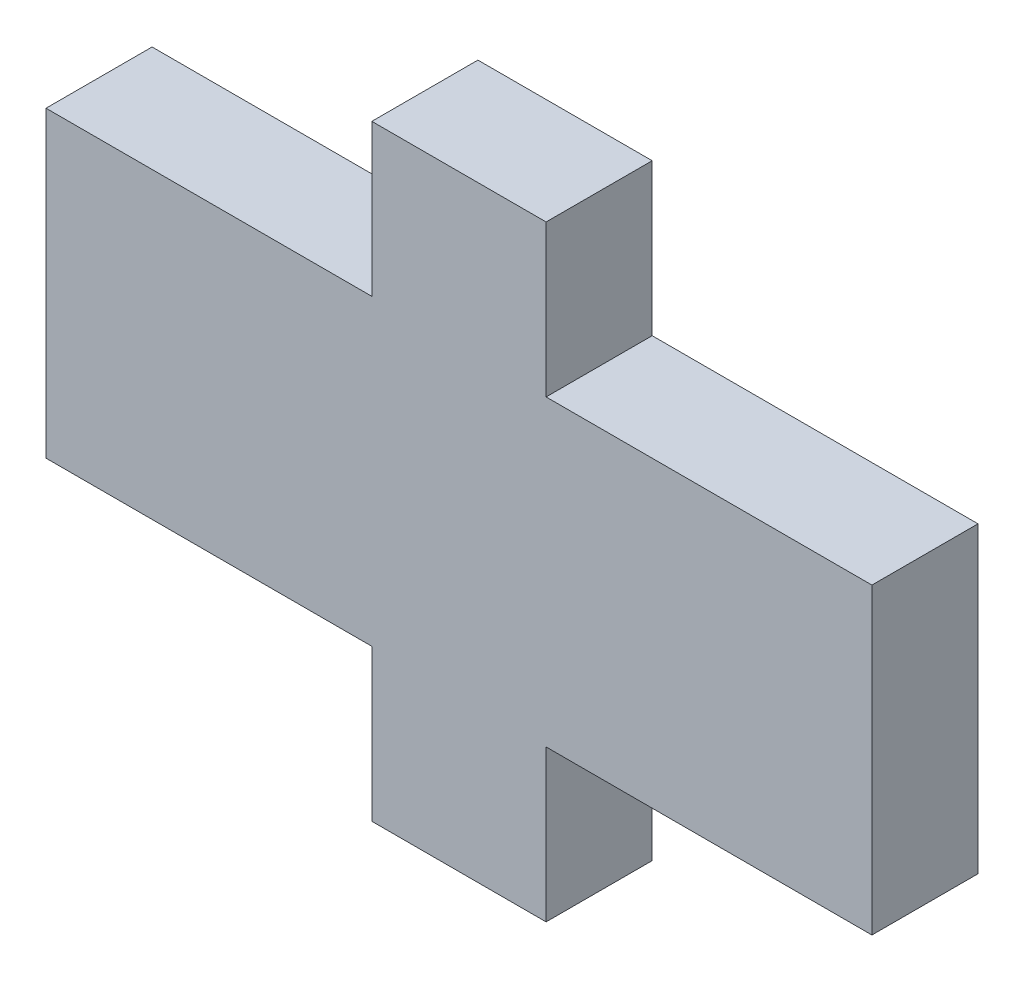
ISO-10303-21;
HEADER;
FILE_DESCRIPTION(('STEP AP214'),'2;1');
FILE_NAME('part.step','',(''),(''),'','','');
FILE_SCHEMA(('AUTOMOTIVE_DESIGN { 1 0 10303 214 1 1 1 1 }'));
ENDSEC;
DATA;
#1=APPLICATION_CONTEXT('core data for automotive mechanical design processes');
#2=APPLICATION_PROTOCOL_DEFINITION('international standard','automotive_design',2000,#1);
#3=PRODUCT_CONTEXT('',#1,'mechanical');
#4=PRODUCT('Part','Part','',(#3));
#5=PRODUCT_RELATED_PRODUCT_CATEGORY('part','',(#4));
#6=PRODUCT_DEFINITION_FORMATION('','',#4);
#7=PRODUCT_DEFINITION_CONTEXT('part definition',#1,'design');
#8=PRODUCT_DEFINITION('design','',#6,#7);
#9=PRODUCT_DEFINITION_SHAPE('','',#8);
#10=(LENGTH_UNIT() NAMED_UNIT(*) SI_UNIT(.MILLI.,.METRE.));
#11=(NAMED_UNIT(*) PLANE_ANGLE_UNIT() SI_UNIT($,.RADIAN.));
#12=(NAMED_UNIT(*) SI_UNIT($,.STERADIAN.) SOLID_ANGLE_UNIT());
#13=UNCERTAINTY_MEASURE_WITH_UNIT(LENGTH_MEASURE(1.E-05),#10,'distance_accuracy_value','');
#14=(GEOMETRIC_REPRESENTATION_CONTEXT(3) GLOBAL_UNCERTAINTY_ASSIGNED_CONTEXT((#13)) GLOBAL_UNIT_ASSIGNED_CONTEXT((#10,
#11,#12)) REPRESENTATION_CONTEXT('',''));
#15=CARTESIAN_POINT('',(0.,0.,0.));
#16=DIRECTION('',(0.,0.,1.));
#17=DIRECTION('',(1.,0.,0.));
#18=AXIS2_PLACEMENT_3D('',#15,#16,#17);
#19=CARTESIAN_POINT('',(-109.,-42.5,28.));
#20=DIRECTION('',(1.,0.,0.));
#21=DIRECTION('',(0.,0.,-1.));
#22=AXIS2_PLACEMENT_3D('',#19,#20,#21);
#23=PLANE('',#22);
#24=DIRECTION('',(0.,-1.,0.));
#25=VECTOR('',#24,1.);
#26=CARTESIAN_POINT('',(-109.,-42.5,0.));
#27=LINE('',#26,#25);
#28=CARTESIAN_POINT('',(-109.,37.5,0.));
#29=VERTEX_POINT('',#28);
#30=CARTESIAN_POINT('',(-109.,-42.5,0.));
#31=VERTEX_POINT('',#30);
#32=EDGE_CURVE('E157',#29,#31,#27,.T.);
#33=ORIENTED_EDGE('',*,*,#32,.T.);
#34=DIRECTION('',(0.,0.,-1.));
#35=VECTOR('',#34,1.);
#36=CARTESIAN_POINT('',(-109.,-42.5,28.));
#37=LINE('',#36,#35);
#38=CARTESIAN_POINT('',(-109.,-42.5,28.));
#39=VERTEX_POINT('',#38);
#40=EDGE_CURVE('E11',#39,#31,#37,.T.);
#41=ORIENTED_EDGE('',*,*,#40,.F.);
#42=DIRECTION('',(0.,-1.,0.));
#43=VECTOR('',#42,1.);
#44=CARTESIAN_POINT('',(-109.,-42.5,28.));
#45=LINE('',#44,#43);
#46=CARTESIAN_POINT('',(-109.,37.5,28.));
#47=VERTEX_POINT('',#46);
#48=EDGE_CURVE('E179',#47,#39,#45,.T.);
#49=ORIENTED_EDGE('',*,*,#48,.F.);
#50=DIRECTION('',(0.,0.,-1.));
#51=VECTOR('',#50,1.);
#52=CARTESIAN_POINT('',(-109.,37.5,28.));
#53=LINE('',#52,#51);
#54=EDGE_CURVE('E153',#47,#29,#53,.T.);
#55=ORIENTED_EDGE('',*,*,#54,.T.);
#56=EDGE_LOOP('',(#33,#41,#49,#55));
#57=FACE_BOUND('',#56,.T.);
#58=ADVANCED_FACE('F37',(#57),#23,.F.);
#59=CARTESIAN_POINT('',(-109.,-42.5,28.));
#60=DIRECTION('',(0.,1.,0.));
#61=DIRECTION('',(0.,0.,1.));
#62=AXIS2_PLACEMENT_3D('',#59,#60,#61);
#63=PLANE('',#62);
#64=DIRECTION('',(1.,0.,0.));
#65=VECTOR('',#64,1.);
#66=CARTESIAN_POINT('',(-109.,-42.5,0.));
#67=LINE('',#66,#65);
#68=CARTESIAN_POINT('',(-23.,-42.5,0.));
#69=VERTEX_POINT('',#68);
#70=EDGE_CURVE('E160',#31,#69,#67,.T.);
#71=ORIENTED_EDGE('',*,*,#70,.T.);
#72=DIRECTION('',(0.,0.,-1.));
#73=VECTOR('',#72,1.);
#74=CARTESIAN_POINT('',(-23.,-42.5,28.));
#75=LINE('',#74,#73);
#76=CARTESIAN_POINT('',(-23.,-42.5,28.));
#77=VERTEX_POINT('',#76);
#78=EDGE_CURVE('E45',#77,#69,#75,.T.);
#79=ORIENTED_EDGE('',*,*,#78,.F.);
#80=DIRECTION('',(1.,0.,0.));
#81=VECTOR('',#80,1.);
#82=CARTESIAN_POINT('',(-109.,-42.5,28.));
#83=LINE('',#82,#81);
#84=EDGE_CURVE('E108',#39,#77,#83,.T.);
#85=ORIENTED_EDGE('',*,*,#84,.F.);
#86=ORIENTED_EDGE('',*,*,#40,.T.);
#87=EDGE_LOOP('',(#71,#79,#85,#86));
#88=FACE_BOUND('',#87,.T.);
#89=ADVANCED_FACE('F257',(#88),#63,.F.);
#90=CARTESIAN_POINT('',(-23.,-42.5,28.));
#91=DIRECTION('',(1.,0.,0.));
#92=DIRECTION('',(0.,0.,-1.));
#93=AXIS2_PLACEMENT_3D('',#90,#91,#92);
#94=PLANE('',#93);
#95=DIRECTION('',(0.,-1.,0.));
#96=VECTOR('',#95,1.);
#97=CARTESIAN_POINT('',(-23.,-42.5,0.));
#98=LINE('',#97,#96);
#99=CARTESIAN_POINT('',(-23.,-82.5,0.));
#100=VERTEX_POINT('',#99);
#101=EDGE_CURVE('E162',#69,#100,#98,.T.);
#102=ORIENTED_EDGE('',*,*,#101,.T.);
#103=DIRECTION('',(0.,0.,-1.));
#104=VECTOR('',#103,1.);
#105=CARTESIAN_POINT('',(-23.,-82.5,28.));
#106=LINE('',#105,#104);
#107=CARTESIAN_POINT('',(-23.,-82.5,28.));
#108=VERTEX_POINT('',#107);
#109=EDGE_CURVE('E198',#108,#100,#106,.T.);
#110=ORIENTED_EDGE('',*,*,#109,.F.);
#111=DIRECTION('',(0.,-1.,0.));
#112=VECTOR('',#111,1.);
#113=CARTESIAN_POINT('',(-23.,-42.5,28.));
#114=LINE('',#113,#112);
#115=EDGE_CURVE('E206',#77,#108,#114,.T.);
#116=ORIENTED_EDGE('',*,*,#115,.F.);
#117=ORIENTED_EDGE('',*,*,#78,.T.);
#118=EDGE_LOOP('',(#102,#110,#116,#117));
#119=FACE_BOUND('',#118,.T.);
#120=ADVANCED_FACE('F204',(#119),#94,.F.);
#121=CARTESIAN_POINT('',(-23.,-82.5,28.));
#122=DIRECTION('',(0.,1.,0.));
#123=DIRECTION('',(0.,0.,1.));
#124=AXIS2_PLACEMENT_3D('',#121,#122,#123);
#125=PLANE('',#124);
#126=DIRECTION('',(1.,0.,0.));
#127=VECTOR('',#126,1.);
#128=CARTESIAN_POINT('',(-23.,-82.5,0.));
#129=LINE('',#128,#127);
#130=CARTESIAN_POINT('',(23.,-82.5,0.));
#131=VERTEX_POINT('',#130);
#132=EDGE_CURVE('E164',#100,#131,#129,.T.);
#133=ORIENTED_EDGE('',*,*,#132,.T.);
#134=DIRECTION('',(0.,0.,-1.));
#135=VECTOR('',#134,1.);
#136=CARTESIAN_POINT('',(23.,-82.5,28.));
#137=LINE('',#136,#135);
#138=CARTESIAN_POINT('',(23.,-82.5,28.));
#139=VERTEX_POINT('',#138);
#140=EDGE_CURVE('E195',#139,#131,#137,.T.);
#141=ORIENTED_EDGE('',*,*,#140,.F.);
#142=DIRECTION('',(1.,0.,0.));
#143=VECTOR('',#142,1.);
#144=CARTESIAN_POINT('',(-23.,-82.5,28.));
#145=LINE('',#144,#143);
#146=EDGE_CURVE('E224',#108,#139,#145,.T.);
#147=ORIENTED_EDGE('',*,*,#146,.F.);
#148=ORIENTED_EDGE('',*,*,#109,.T.);
#149=EDGE_LOOP('',(#133,#141,#147,#148));
#150=FACE_BOUND('',#149,.T.);
#151=ADVANCED_FACE('F215',(#150),#125,.F.);
#152=CARTESIAN_POINT('',(23.,-42.5,28.));
#153=DIRECTION('',(-1.,0.,0.));
#154=DIRECTION('',(0.,0.,1.));
#155=AXIS2_PLACEMENT_3D('',#152,#153,#154);
#156=PLANE('',#155);
#157=DIRECTION('',(0.,1.,0.));
#158=VECTOR('',#157,1.);
#159=CARTESIAN_POINT('',(23.,-42.5,0.));
#160=LINE('',#159,#158);
#161=CARTESIAN_POINT('',(23.,-42.5,0.));
#162=VERTEX_POINT('',#161);
#163=EDGE_CURVE('E166',#131,#162,#160,.T.);
#164=ORIENTED_EDGE('',*,*,#163,.T.);
#165=DIRECTION('',(0.,0.,-1.));
#166=VECTOR('',#165,1.);
#167=CARTESIAN_POINT('',(23.,-42.5,28.));
#168=LINE('',#167,#166);
#169=CARTESIAN_POINT('',(23.,-42.5,28.));
#170=VERTEX_POINT('',#169);
#171=EDGE_CURVE('E192',#170,#162,#168,.T.);
#172=ORIENTED_EDGE('',*,*,#171,.F.);
#173=DIRECTION('',(0.,1.,0.));
#174=VECTOR('',#173,1.);
#175=CARTESIAN_POINT('',(23.,-42.5,28.));
#176=LINE('',#175,#174);
#177=EDGE_CURVE('E221',#139,#170,#176,.T.);
#178=ORIENTED_EDGE('',*,*,#177,.F.);
#179=ORIENTED_EDGE('',*,*,#140,.T.);
#180=EDGE_LOOP('',(#164,#172,#178,#179));
#181=FACE_BOUND('',#180,.T.);
#182=ADVANCED_FACE('F219',(#181),#156,.F.);
#183=CARTESIAN_POINT('',(109.,-42.5,28.));
#184=DIRECTION('',(0.,1.,0.));
#185=DIRECTION('',(0.,0.,1.));
#186=AXIS2_PLACEMENT_3D('',#183,#184,#185);
#187=PLANE('',#186);
#188=DIRECTION('',(1.,0.,0.));
#189=VECTOR('',#188,1.);
#190=CARTESIAN_POINT('',(109.,-42.5,0.));
#191=LINE('',#190,#189);
#192=CARTESIAN_POINT('',(109.,-42.5,0.));
#193=VERTEX_POINT('',#192);
#194=EDGE_CURVE('E168',#162,#193,#191,.T.);
#195=ORIENTED_EDGE('',*,*,#194,.T.);
#196=DIRECTION('',(0.,0.,-1.));
#197=VECTOR('',#196,1.);
#198=CARTESIAN_POINT('',(109.,-42.5,28.));
#199=LINE('',#198,#197);
#200=CARTESIAN_POINT('',(109.,-42.5,28.));
#201=VERTEX_POINT('',#200);
#202=EDGE_CURVE('E189',#201,#193,#199,.T.);
#203=ORIENTED_EDGE('',*,*,#202,.F.);
#204=DIRECTION('',(1.,0.,0.));
#205=VECTOR('',#204,1.);
#206=CARTESIAN_POINT('',(109.,-42.5,28.));
#207=LINE('',#206,#205);
#208=EDGE_CURVE('E223',#170,#201,#207,.T.);
#209=ORIENTED_EDGE('',*,*,#208,.F.);
#210=ORIENTED_EDGE('',*,*,#171,.T.);
#211=EDGE_LOOP('',(#195,#203,#209,#210));
#212=FACE_BOUND('',#211,.T.);
#213=ADVANCED_FACE('F270',(#212),#187,.F.);
#214=CARTESIAN_POINT('',(109.,-42.5,28.));
#215=DIRECTION('',(-1.,0.,0.));
#216=DIRECTION('',(0.,0.,1.));
#217=AXIS2_PLACEMENT_3D('',#214,#215,#216);
#218=PLANE('',#217);
#219=DIRECTION('',(0.,1.,0.));
#220=VECTOR('',#219,1.);
#221=CARTESIAN_POINT('',(109.,-42.5,0.));
#222=LINE('',#221,#220);
#223=CARTESIAN_POINT('',(109.,37.5,0.));
#224=VERTEX_POINT('',#223);
#225=EDGE_CURVE('E170',#193,#224,#222,.T.);
#226=ORIENTED_EDGE('',*,*,#225,.T.);
#227=DIRECTION('',(0.,0.,-1.));
#228=VECTOR('',#227,1.);
#229=CARTESIAN_POINT('',(109.,37.5,28.));
#230=LINE('',#229,#228);
#231=CARTESIAN_POINT('',(109.,37.5,28.));
#232=VERTEX_POINT('',#231);
#233=EDGE_CURVE('E186',#232,#224,#230,.T.);
#234=ORIENTED_EDGE('',*,*,#233,.F.);
#235=DIRECTION('',(0.,1.,0.));
#236=VECTOR('',#235,1.);
#237=CARTESIAN_POINT('',(109.,-42.5,28.));
#238=LINE('',#237,#236);
#239=EDGE_CURVE('E226',#201,#232,#238,.T.);
#240=ORIENTED_EDGE('',*,*,#239,.F.);
#241=ORIENTED_EDGE('',*,*,#202,.T.);
#242=EDGE_LOOP('',(#226,#234,#240,#241));
#243=FACE_BOUND('',#242,.T.);
#244=ADVANCED_FACE('F273',(#243),#218,.F.);
#245=CARTESIAN_POINT('',(109.,37.5,28.));
#246=DIRECTION('',(0.,-1.,0.));
#247=DIRECTION('',(0.,0.,-1.));
#248=AXIS2_PLACEMENT_3D('',#245,#246,#247);
#249=PLANE('',#248);
#250=DIRECTION('',(-1.,0.,0.));
#251=VECTOR('',#250,1.);
#252=CARTESIAN_POINT('',(109.,37.5,0.));
#253=LINE('',#252,#251);
#254=CARTESIAN_POINT('',(23.,37.5,0.));
#255=VERTEX_POINT('',#254);
#256=EDGE_CURVE('E172',#224,#255,#253,.T.);
#257=ORIENTED_EDGE('',*,*,#256,.T.);
#258=DIRECTION('',(0.,0.,-1.));
#259=VECTOR('',#258,1.);
#260=CARTESIAN_POINT('',(23.,37.5,28.));
#261=LINE('',#260,#259);
#262=CARTESIAN_POINT('',(23.,37.5,28.));
#263=VERTEX_POINT('',#262);
#264=EDGE_CURVE('E183',#263,#255,#261,.T.);
#265=ORIENTED_EDGE('',*,*,#264,.F.);
#266=DIRECTION('',(-1.,0.,0.));
#267=VECTOR('',#266,1.);
#268=CARTESIAN_POINT('',(109.,37.5,28.));
#269=LINE('',#268,#267);
#270=EDGE_CURVE('E232',#232,#263,#269,.T.);
#271=ORIENTED_EDGE('',*,*,#270,.F.);
#272=ORIENTED_EDGE('',*,*,#233,.T.);
#273=EDGE_LOOP('',(#257,#265,#271,#272));
#274=FACE_BOUND('',#273,.T.);
#275=ADVANCED_FACE('F238',(#274),#249,.F.);
#276=CARTESIAN_POINT('',(23.,37.5,28.));
#277=DIRECTION('',(-1.,0.,0.));
#278=DIRECTION('',(0.,0.,1.));
#279=AXIS2_PLACEMENT_3D('',#276,#277,#278);
#280=PLANE('',#279);
#281=DIRECTION('',(0.,1.,0.));
#282=VECTOR('',#281,1.);
#283=CARTESIAN_POINT('',(23.,37.5,0.));
#284=LINE('',#283,#282);
#285=CARTESIAN_POINT('',(23.,77.5,0.));
#286=VERTEX_POINT('',#285);
#287=EDGE_CURVE('E174',#255,#286,#284,.T.);
#288=ORIENTED_EDGE('',*,*,#287,.T.);
#289=DIRECTION('',(0.,0.,-1.));
#290=VECTOR('',#289,1.);
#291=CARTESIAN_POINT('',(23.,77.5,28.));
#292=LINE('',#291,#290);
#293=CARTESIAN_POINT('',(23.,77.5,28.));
#294=VERTEX_POINT('',#293);
#295=EDGE_CURVE('E148',#294,#286,#292,.T.);
#296=ORIENTED_EDGE('',*,*,#295,.F.);
#297=DIRECTION('',(0.,1.,0.));
#298=VECTOR('',#297,1.);
#299=CARTESIAN_POINT('',(23.,37.5,28.));
#300=LINE('',#299,#298);
#301=EDGE_CURVE('E139',#263,#294,#300,.T.);
#302=ORIENTED_EDGE('',*,*,#301,.F.);
#303=ORIENTED_EDGE('',*,*,#264,.T.);
#304=EDGE_LOOP('',(#288,#296,#302,#303));
#305=FACE_BOUND('',#304,.T.);
#306=ADVANCED_FACE('F242',(#305),#280,.F.);
#307=CARTESIAN_POINT('',(-23.,77.5,28.));
#308=DIRECTION('',(0.,-1.,0.));
#309=DIRECTION('',(0.,0.,-1.));
#310=AXIS2_PLACEMENT_3D('',#307,#308,#309);
#311=PLANE('',#310);
#312=DIRECTION('',(-1.,0.,0.));
#313=VECTOR('',#312,1.);
#314=CARTESIAN_POINT('',(-23.,77.5,0.));
#315=LINE('',#314,#313);
#316=CARTESIAN_POINT('',(-23.,77.5,0.));
#317=VERTEX_POINT('',#316);
#318=EDGE_CURVE('E147',#286,#317,#315,.T.);
#319=ORIENTED_EDGE('',*,*,#318,.T.);
#320=DIRECTION('',(0.,0.,-1.));
#321=VECTOR('',#320,1.);
#322=CARTESIAN_POINT('',(-23.,77.5,28.));
#323=LINE('',#322,#321);
#324=CARTESIAN_POINT('',(-23.,77.5,28.));
#325=VERTEX_POINT('',#324);
#326=EDGE_CURVE('E144',#325,#317,#323,.T.);
#327=ORIENTED_EDGE('',*,*,#326,.F.);
#328=DIRECTION('',(-1.,0.,0.));
#329=VECTOR('',#328,1.);
#330=CARTESIAN_POINT('',(-23.,77.5,28.));
#331=LINE('',#330,#329);
#332=EDGE_CURVE('E133',#294,#325,#331,.T.);
#333=ORIENTED_EDGE('',*,*,#332,.F.);
#334=ORIENTED_EDGE('',*,*,#295,.T.);
#335=EDGE_LOOP('',(#319,#327,#333,#334));
#336=FACE_BOUND('',#335,.T.);
#337=ADVANCED_FACE('F145',(#336),#311,.F.);
#338=CARTESIAN_POINT('',(-23.,37.5,28.));
#339=DIRECTION('',(1.,0.,0.));
#340=DIRECTION('',(0.,0.,-1.));
#341=AXIS2_PLACEMENT_3D('',#338,#339,#340);
#342=PLANE('',#341);
#343=DIRECTION('',(0.,-1.,0.));
#344=VECTOR('',#343,1.);
#345=CARTESIAN_POINT('',(-23.,37.5,0.));
#346=LINE('',#345,#344);
#347=CARTESIAN_POINT('',(-23.,37.5,0.));
#348=VERTEX_POINT('',#347);
#349=EDGE_CURVE('E94',#317,#348,#346,.T.);
#350=ORIENTED_EDGE('',*,*,#349,.T.);
#351=DIRECTION('',(0.,0.,-1.));
#352=VECTOR('',#351,1.);
#353=CARTESIAN_POINT('',(-23.,37.5,28.));
#354=LINE('',#353,#352);
#355=CARTESIAN_POINT('',(-23.,37.5,28.));
#356=VERTEX_POINT('',#355);
#357=EDGE_CURVE('E149',#356,#348,#354,.T.);
#358=ORIENTED_EDGE('',*,*,#357,.F.);
#359=DIRECTION('',(0.,-1.,0.));
#360=VECTOR('',#359,1.);
#361=CARTESIAN_POINT('',(-23.,37.5,28.));
#362=LINE('',#361,#360);
#363=EDGE_CURVE('E137',#325,#356,#362,.T.);
#364=ORIENTED_EDGE('',*,*,#363,.F.);
#365=ORIENTED_EDGE('',*,*,#326,.T.);
#366=EDGE_LOOP('',(#350,#358,#364,#365));
#367=FACE_BOUND('',#366,.T.);
#368=ADVANCED_FACE('F151',(#367),#342,.F.);
#369=CARTESIAN_POINT('',(-109.,37.5,28.));
#370=DIRECTION('',(0.,-1.,0.));
#371=DIRECTION('',(0.,0.,-1.));
#372=AXIS2_PLACEMENT_3D('',#369,#370,#371);
#373=PLANE('',#372);
#374=DIRECTION('',(-1.,0.,0.));
#375=VECTOR('',#374,1.);
#376=CARTESIAN_POINT('',(-109.,37.5,0.));
#377=LINE('',#376,#375);
#378=EDGE_CURVE('E100',#348,#29,#377,.T.);
#379=ORIENTED_EDGE('',*,*,#378,.T.);
#380=ORIENTED_EDGE('',*,*,#54,.F.);
#381=DIRECTION('',(-1.,0.,0.));
#382=VECTOR('',#381,1.);
#383=CARTESIAN_POINT('',(-109.,37.5,28.));
#384=LINE('',#383,#382);
#385=EDGE_CURVE('E53',#356,#47,#384,.T.);
#386=ORIENTED_EDGE('',*,*,#385,.F.);
#387=ORIENTED_EDGE('',*,*,#357,.T.);
#388=EDGE_LOOP('',(#379,#380,#386,#387));
#389=FACE_BOUND('',#388,.T.);
#390=ADVANCED_FACE('F246',(#389),#373,.F.);
#391=CARTESIAN_POINT('',(0.,0.,28.));
#392=DIRECTION('',(0.,0.,-1.));
#393=DIRECTION('',(-1.,0.,0.));
#394=AXIS2_PLACEMENT_3D('',#391,#392,#393);
#395=PLANE('',#394);
#396=ORIENTED_EDGE('',*,*,#48,.T.);
#397=ORIENTED_EDGE('',*,*,#84,.T.);
#398=ORIENTED_EDGE('',*,*,#115,.T.);
#399=ORIENTED_EDGE('',*,*,#146,.T.);
#400=ORIENTED_EDGE('',*,*,#177,.T.);
#401=ORIENTED_EDGE('',*,*,#208,.T.);
#402=ORIENTED_EDGE('',*,*,#239,.T.);
#403=ORIENTED_EDGE('',*,*,#270,.T.);
#404=ORIENTED_EDGE('',*,*,#301,.T.);
#405=ORIENTED_EDGE('',*,*,#332,.T.);
#406=ORIENTED_EDGE('',*,*,#363,.T.);
#407=ORIENTED_EDGE('',*,*,#385,.T.);
#408=EDGE_LOOP('',(#396,#397,#398,#399,#400,#401,#402,#403,#404,#405,#406,#407));
#409=FACE_BOUND('',#408,.T.);
#410=ADVANCED_FACE('F135',(#409),#395,.F.);
#411=CARTESIAN_POINT('',(0.,0.,0.));
#412=DIRECTION('',(0.,0.,-1.));
#413=DIRECTION('',(-1.,0.,0.));
#414=AXIS2_PLACEMENT_3D('',#411,#412,#413);
#415=PLANE('',#414);
#416=ORIENTED_EDGE('',*,*,#32,.F.);
#417=ORIENTED_EDGE('',*,*,#378,.F.);
#418=ORIENTED_EDGE('',*,*,#349,.F.);
#419=ORIENTED_EDGE('',*,*,#318,.F.);
#420=ORIENTED_EDGE('',*,*,#287,.F.);
#421=ORIENTED_EDGE('',*,*,#256,.F.);
#422=ORIENTED_EDGE('',*,*,#225,.F.);
#423=ORIENTED_EDGE('',*,*,#194,.F.);
#424=ORIENTED_EDGE('',*,*,#163,.F.);
#425=ORIENTED_EDGE('',*,*,#132,.F.);
#426=ORIENTED_EDGE('',*,*,#101,.F.);
#427=ORIENTED_EDGE('',*,*,#70,.F.);
#428=EDGE_LOOP('',(#416,#417,#418,#419,#420,#421,#422,#423,#424,#425,#426,#427));
#429=FACE_BOUND('',#428,.T.);
#430=ADVANCED_FACE('F210',(#429),#415,.T.);
#431=CLOSED_SHELL('',(#58,#89,#120,#151,#182,#213,#244,#275,#306,#337,#368,#390,#410,#430));
#432=MANIFOLD_SOLID_BREP('B2',#431);
#433=ADVANCED_BREP_SHAPE_REPRESENTATION('',(#18,#432),#14);
#434=SHAPE_DEFINITION_REPRESENTATION(#9,#433);
ENDSEC;
END-ISO-10303-21;
